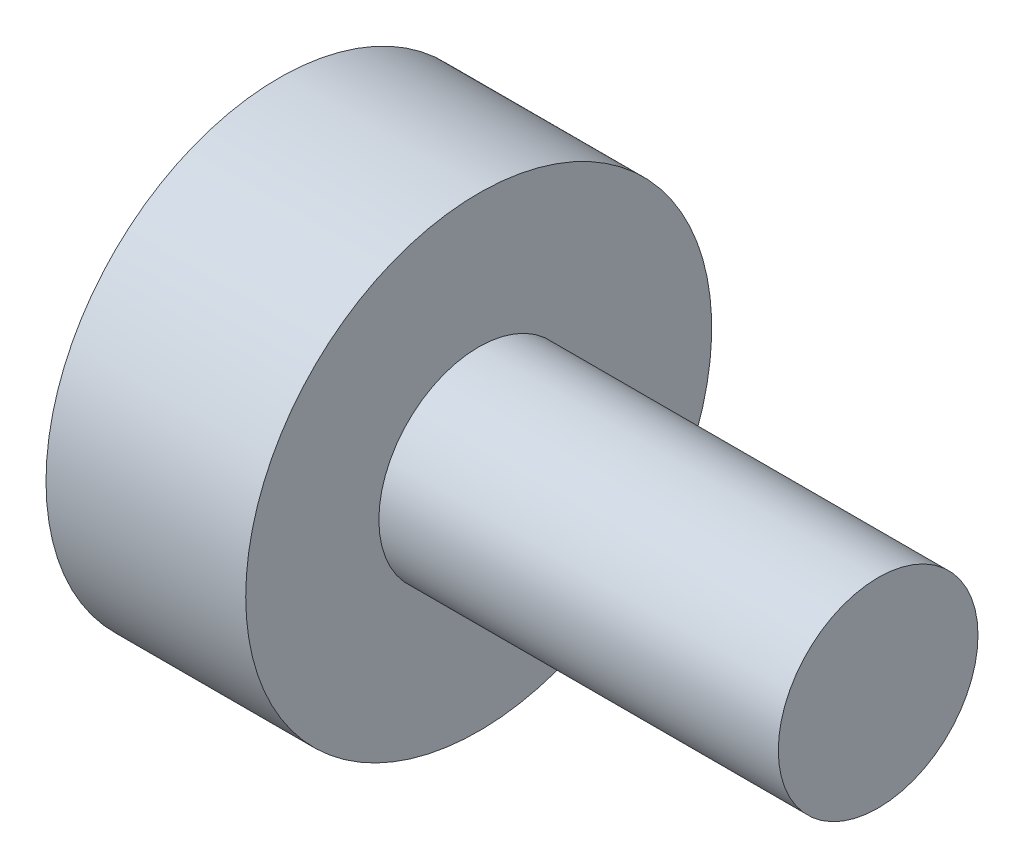
ISO-10303-21;
HEADER;
FILE_DESCRIPTION(('STEP AP214'),'2;1');
FILE_NAME('part.step','',(''),(''),'','','');
FILE_SCHEMA(('AUTOMOTIVE_DESIGN { 1 0 10303 214 1 1 1 1 }'));
ENDSEC;
DATA;
#1=APPLICATION_CONTEXT('core data for automotive mechanical design processes');
#2=APPLICATION_PROTOCOL_DEFINITION('international standard','automotive_design',2000,#1);
#3=PRODUCT_CONTEXT('',#1,'mechanical');
#4=PRODUCT('Part','Part','',(#3));
#5=PRODUCT_RELATED_PRODUCT_CATEGORY('part','',(#4));
#6=PRODUCT_DEFINITION_FORMATION('','',#4);
#7=PRODUCT_DEFINITION_CONTEXT('part definition',#1,'design');
#8=PRODUCT_DEFINITION('design','',#6,#7);
#9=PRODUCT_DEFINITION_SHAPE('','',#8);
#10=(LENGTH_UNIT() NAMED_UNIT(*) SI_UNIT(.MILLI.,.METRE.));
#11=(NAMED_UNIT(*) PLANE_ANGLE_UNIT() SI_UNIT($,.RADIAN.));
#12=(NAMED_UNIT(*) SI_UNIT($,.STERADIAN.) SOLID_ANGLE_UNIT());
#13=UNCERTAINTY_MEASURE_WITH_UNIT(LENGTH_MEASURE(1.E-05),#10,'distance_accuracy_value','');
#14=(GEOMETRIC_REPRESENTATION_CONTEXT(3) GLOBAL_UNCERTAINTY_ASSIGNED_CONTEXT((#13)) GLOBAL_UNIT_ASSIGNED_CONTEXT((#10,
#11,#12)) REPRESENTATION_CONTEXT('',''));
#15=CARTESIAN_POINT('',(0.,0.,0.));
#16=DIRECTION('',(0.,0.,1.));
#17=DIRECTION('',(1.,0.,0.));
#18=AXIS2_PLACEMENT_3D('',#15,#16,#17);
#19=CARTESIAN_POINT('',(0.,0.,0.));
#20=DIRECTION('',(1.,0.,0.));
#21=DIRECTION('',(0.,0.,-1.));
#22=AXIS2_PLACEMENT_3D('',#19,#20,#21);
#23=PLANE('',#22);
#24=CARTESIAN_POINT('',(0.,0.,0.));
#25=DIRECTION('',(1.,0.,0.));
#26=DIRECTION('',(0.,0.,-1.));
#27=AXIS2_PLACEMENT_3D('',#24,#25,#26);
#28=CIRCLE('',#27,5.);
#29=CARTESIAN_POINT('',(0.,0.,-5.));
#30=VERTEX_POINT('',#29);
#31=EDGE_CURVE('E63',#30,#30,#28,.T.);
#32=ORIENTED_EDGE('',*,*,#31,.T.);
#33=EDGE_LOOP('',(#32));
#34=FACE_BOUND('',#33,.T.);
#35=CARTESIAN_POINT('',(0.,0.,0.));
#36=DIRECTION('',(-1.,0.,0.));
#37=DIRECTION('',(0.,0.,1.));
#38=AXIS2_PLACEMENT_3D('',#35,#36,#37);
#39=CIRCLE('',#38,20.);
#40=CARTESIAN_POINT('',(0.,0.,20.));
#41=VERTEX_POINT('',#40);
#42=EDGE_CURVE('E10',#41,#41,#39,.T.);
#43=ORIENTED_EDGE('',*,*,#42,.T.);
#44=EDGE_LOOP('',(#43));
#45=FACE_BOUND('',#44,.T.);
#46=ADVANCED_FACE('F37',(#34,#45),#23,.F.);
#47=CARTESIAN_POINT('',(0.,0.,0.));
#48=DIRECTION('',(-1.,0.,0.));
#49=DIRECTION('',(0.,0.,1.));
#50=AXIS2_PLACEMENT_3D('',#47,#48,#49);
#51=CYLINDRICAL_SURFACE('',#50,20.);
#52=ORIENTED_EDGE('',*,*,#42,.F.);
#53=EDGE_LOOP('',(#52));
#54=FACE_BOUND('',#53,.T.);
#55=CARTESIAN_POINT('',(10.,0.,0.));
#56=DIRECTION('',(-1.,0.,0.));
#57=DIRECTION('',(0.,0.,1.));
#58=AXIS2_PLACEMENT_3D('',#55,#56,#57);
#59=CIRCLE('',#58,20.);
#60=CARTESIAN_POINT('',(10.,0.,20.));
#61=VERTEX_POINT('',#60);
#62=EDGE_CURVE('E43',#61,#61,#59,.T.);
#63=ORIENTED_EDGE('',*,*,#62,.T.);
#64=EDGE_LOOP('',(#63));
#65=FACE_BOUND('',#64,.T.);
#66=ADVANCED_FACE('F81',(#54,#65),#51,.T.);
#67=CARTESIAN_POINT('',(10.,20.,0.));
#68=DIRECTION('',(1.,0.,0.));
#69=DIRECTION('',(0.,0.,-1.));
#70=AXIS2_PLACEMENT_3D('',#67,#68,#69);
#71=PLANE('',#70);
#72=ORIENTED_EDGE('',*,*,#62,.F.);
#73=EDGE_LOOP('',(#72));
#74=FACE_BOUND('',#73,.T.);
#75=CARTESIAN_POINT('',(10.,0.,0.));
#76=DIRECTION('',(-1.,0.,0.));
#77=DIRECTION('',(0.,0.,1.));
#78=AXIS2_PLACEMENT_3D('',#75,#76,#77);
#79=CIRCLE('',#78,35.);
#80=CARTESIAN_POINT('',(10.,0.,35.));
#81=VERTEX_POINT('',#80);
#82=EDGE_CURVE('E47',#81,#81,#79,.T.);
#83=ORIENTED_EDGE('',*,*,#82,.T.);
#84=EDGE_LOOP('',(#83));
#85=FACE_BOUND('',#84,.T.);
#86=ADVANCED_FACE('F87',(#74,#85),#71,.F.);
#87=CARTESIAN_POINT('',(0.,0.,0.));
#88=DIRECTION('',(-1.,0.,0.));
#89=DIRECTION('',(0.,0.,1.));
#90=AXIS2_PLACEMENT_3D('',#87,#88,#89);
#91=CYLINDRICAL_SURFACE('',#90,35.);
#92=ORIENTED_EDGE('',*,*,#82,.F.);
#93=EDGE_LOOP('',(#92));
#94=FACE_BOUND('',#93,.T.);
#95=CARTESIAN_POINT('',(40.,0.,0.));
#96=DIRECTION('',(-1.,0.,0.));
#97=DIRECTION('',(0.,0.,1.));
#98=AXIS2_PLACEMENT_3D('',#95,#96,#97);
#99=CIRCLE('',#98,35.);
#100=CARTESIAN_POINT('',(40.,0.,35.));
#101=VERTEX_POINT('',#100);
#102=EDGE_CURVE('E51',#101,#101,#99,.T.);
#103=ORIENTED_EDGE('',*,*,#102,.T.);
#104=EDGE_LOOP('',(#103));
#105=FACE_BOUND('',#104,.T.);
#106=ADVANCED_FACE('F93',(#94,#105),#91,.T.);
#107=CARTESIAN_POINT('',(40.,35.,0.));
#108=DIRECTION('',(-1.,0.,0.));
#109=DIRECTION('',(0.,0.,1.));
#110=AXIS2_PLACEMENT_3D('',#107,#108,#109);
#111=PLANE('',#110);
#112=ORIENTED_EDGE('',*,*,#102,.F.);
#113=EDGE_LOOP('',(#112));
#114=FACE_BOUND('',#113,.T.);
#115=CARTESIAN_POINT('',(40.,0.,0.));
#116=DIRECTION('',(-1.,0.,0.));
#117=DIRECTION('',(0.,0.,1.));
#118=AXIS2_PLACEMENT_3D('',#115,#116,#117);
#119=CIRCLE('',#118,15.);
#120=CARTESIAN_POINT('',(40.,0.,15.));
#121=VERTEX_POINT('',#120);
#122=EDGE_CURVE('E56',#121,#121,#119,.T.);
#123=ORIENTED_EDGE('',*,*,#122,.T.);
#124=EDGE_LOOP('',(#123));
#125=FACE_BOUND('',#124,.T.);
#126=ADVANCED_FACE('F99',(#114,#125),#111,.F.);
#127=CARTESIAN_POINT('',(0.,0.,0.));
#128=DIRECTION('',(-1.,0.,0.));
#129=DIRECTION('',(0.,0.,1.));
#130=AXIS2_PLACEMENT_3D('',#127,#128,#129);
#131=CYLINDRICAL_SURFACE('',#130,15.);
#132=ORIENTED_EDGE('',*,*,#122,.F.);
#133=EDGE_LOOP('',(#132));
#134=FACE_BOUND('',#133,.T.);
#135=CARTESIAN_POINT('',(100.,0.,0.));
#136=DIRECTION('',(-1.,0.,0.));
#137=DIRECTION('',(0.,0.,1.));
#138=AXIS2_PLACEMENT_3D('',#135,#136,#137);
#139=CIRCLE('',#138,15.);
#140=CARTESIAN_POINT('',(100.,0.,15.));
#141=VERTEX_POINT('',#140);
#142=EDGE_CURVE('E59',#141,#141,#139,.T.);
#143=ORIENTED_EDGE('',*,*,#142,.T.);
#144=EDGE_LOOP('',(#143));
#145=FACE_BOUND('',#144,.T.);
#146=ADVANCED_FACE('F103',(#134,#145),#131,.T.);
#147=CARTESIAN_POINT('',(100.,0.,0.));
#148=DIRECTION('',(-1.,0.,0.));
#149=DIRECTION('',(0.,0.,1.));
#150=AXIS2_PLACEMENT_3D('',#147,#148,#149);
#151=PLANE('',#150);
#152=ORIENTED_EDGE('',*,*,#142,.F.);
#153=EDGE_LOOP('',(#152));
#154=FACE_BOUND('',#153,.T.);
#155=ADVANCED_FACE('F78',(#154),#151,.F.);
#156=CARTESIAN_POINT('',(20.,0.,0.));
#157=DIRECTION('',(-1.,0.,0.));
#158=DIRECTION('',(0.,0.,1.));
#159=AXIS2_PLACEMENT_3D('',#156,#157,#158);
#160=CYLINDRICAL_SURFACE('',#159,5.);
#161=CARTESIAN_POINT('',(20.,0.,0.));
#162=DIRECTION('',(1.,0.,0.));
#163=DIRECTION('',(0.,0.,-1.));
#164=AXIS2_PLACEMENT_3D('',#161,#162,#163);
#165=CIRCLE('',#164,5.);
#166=CARTESIAN_POINT('',(20.,0.,-5.));
#167=VERTEX_POINT('',#166);
#168=EDGE_CURVE('E62',#167,#167,#165,.T.);
#169=ORIENTED_EDGE('',*,*,#168,.T.);
#170=EDGE_LOOP('',(#169));
#171=FACE_BOUND('',#170,.T.);
#172=ORIENTED_EDGE('',*,*,#31,.F.);
#173=EDGE_LOOP('',(#172));
#174=FACE_BOUND('',#173,.T.);
#175=ADVANCED_FACE('F69',(#171,#174),#160,.F.);
#176=CARTESIAN_POINT('',(20.,0.,0.));
#177=DIRECTION('',(1.,0.,0.));
#178=DIRECTION('',(0.,0.,-1.));
#179=AXIS2_PLACEMENT_3D('',#176,#177,#178);
#180=PLANE('',#179);
#181=ORIENTED_EDGE('',*,*,#168,.F.);
#182=EDGE_LOOP('',(#181));
#183=FACE_BOUND('',#182,.T.);
#184=ADVANCED_FACE('F72',(#183),#180,.F.);
#185=CLOSED_SHELL('',(#46,#66,#86,#106,#126,#146,#155,#175,#184));
#186=MANIFOLD_SOLID_BREP('B2',#185);
#187=ADVANCED_BREP_SHAPE_REPRESENTATION('',(#18,#186),#14);
#188=SHAPE_DEFINITION_REPRESENTATION(#9,#187);
ENDSEC;
END-ISO-10303-21;
